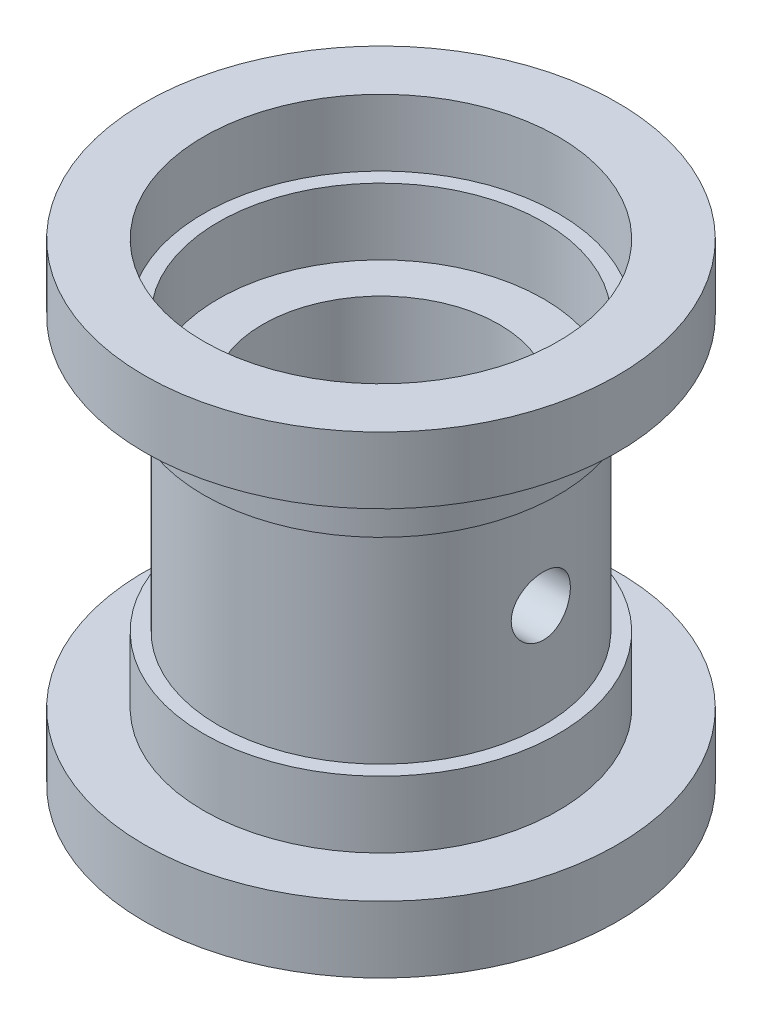
ISO-10303-21;
HEADER;
FILE_DESCRIPTION(('STEP AP214'),'2;1');
FILE_NAME('part.step','',(''),(''),'','','');
FILE_SCHEMA(('AUTOMOTIVE_DESIGN { 1 0 10303 214 1 1 1 1 }'));
ENDSEC;
DATA;
#1=APPLICATION_CONTEXT('core data for automotive mechanical design processes');
#2=APPLICATION_PROTOCOL_DEFINITION('international standard','automotive_design',2000,#1);
#3=PRODUCT_CONTEXT('',#1,'mechanical');
#4=PRODUCT('Part','Part','',(#3));
#5=PRODUCT_RELATED_PRODUCT_CATEGORY('part','',(#4));
#6=PRODUCT_DEFINITION_FORMATION('','',#4);
#7=PRODUCT_DEFINITION_CONTEXT('part definition',#1,'design');
#8=PRODUCT_DEFINITION('design','',#6,#7);
#9=PRODUCT_DEFINITION_SHAPE('','',#8);
#10=(LENGTH_UNIT() NAMED_UNIT(*) SI_UNIT(.MILLI.,.METRE.));
#11=(NAMED_UNIT(*) PLANE_ANGLE_UNIT() SI_UNIT($,.RADIAN.));
#12=(NAMED_UNIT(*) SI_UNIT($,.STERADIAN.) SOLID_ANGLE_UNIT());
#13=UNCERTAINTY_MEASURE_WITH_UNIT(LENGTH_MEASURE(1.E-05),#10,'distance_accuracy_value','');
#14=(GEOMETRIC_REPRESENTATION_CONTEXT(3) GLOBAL_UNCERTAINTY_ASSIGNED_CONTEXT((#13)) GLOBAL_UNIT_ASSIGNED_CONTEXT((#10,
#11,#12)) REPRESENTATION_CONTEXT('',''));
#15=CARTESIAN_POINT('',(0.,0.,0.));
#16=DIRECTION('',(0.,0.,1.));
#17=DIRECTION('',(1.,0.,0.));
#18=AXIS2_PLACEMENT_3D('',#15,#16,#17);
#19=CARTESIAN_POINT('',(0.,32.,0.));
#20=DIRECTION('',(0.,-1.,0.));
#21=DIRECTION('',(0.,0.,-1.));
#22=AXIS2_PLACEMENT_3D('',#19,#20,#21);
#23=CYLINDRICAL_SURFACE('',#22,32.);
#24=CARTESIAN_POINT('',(0.,-32.,0.));
#25=DIRECTION('',(0.,1.,0.));
#26=DIRECTION('',(0.,0.,1.));
#27=AXIS2_PLACEMENT_3D('',#24,#25,#26);
#28=CIRCLE('',#27,32.);
#29=CARTESIAN_POINT('',(0.,-32.,32.));
#30=VERTEX_POINT('',#29);
#31=EDGE_CURVE('E59',#30,#30,#28,.T.);
#32=ORIENTED_EDGE('',*,*,#31,.T.);
#33=EDGE_LOOP('',(#32));
#34=FACE_BOUND('',#33,.T.);
#35=CARTESIAN_POINT('',(0.,-23.,0.));
#36=DIRECTION('',(0.,1.,0.));
#37=DIRECTION('',(0.,0.,1.));
#38=AXIS2_PLACEMENT_3D('',#35,#36,#37);
#39=CIRCLE('',#38,32.);
#40=CARTESIAN_POINT('',(0.,-23.,32.));
#41=VERTEX_POINT('',#40);
#42=EDGE_CURVE('E11',#41,#41,#39,.T.);
#43=ORIENTED_EDGE('',*,*,#42,.F.);
#44=EDGE_LOOP('',(#43));
#45=FACE_BOUND('',#44,.T.);
#46=ADVANCED_FACE('F46',(#34,#45),#23,.T.);
#47=CARTESIAN_POINT('',(0.,32.,0.));
#48=DIRECTION('',(0.,-1.,0.));
#49=DIRECTION('',(0.,0.,-1.));
#50=AXIS2_PLACEMENT_3D('',#47,#48,#49);
#51=CYLINDRICAL_SURFACE('',#50,24.);
#52=CARTESIAN_POINT('',(0.,-32.,0.));
#53=DIRECTION('',(0.,1.,0.));
#54=DIRECTION('',(0.,0.,1.));
#55=AXIS2_PLACEMENT_3D('',#52,#53,#54);
#56=CIRCLE('',#55,24.);
#57=CARTESIAN_POINT('',(0.,-32.,24.));
#58=VERTEX_POINT('',#57);
#59=EDGE_CURVE('E53',#58,#58,#56,.T.);
#60=ORIENTED_EDGE('',*,*,#59,.F.);
#61=EDGE_LOOP('',(#60));
#62=FACE_BOUND('',#61,.T.);
#63=CARTESIAN_POINT('',(0.,-23.,0.));
#64=DIRECTION('',(0.,1.,0.));
#65=DIRECTION('',(0.,0.,1.));
#66=AXIS2_PLACEMENT_3D('',#63,#64,#65);
#67=CIRCLE('',#66,24.);
#68=CARTESIAN_POINT('',(0.,-23.,24.));
#69=VERTEX_POINT('',#68);
#70=EDGE_CURVE('E49',#69,#69,#67,.T.);
#71=ORIENTED_EDGE('',*,*,#70,.T.);
#72=EDGE_LOOP('',(#71));
#73=FACE_BOUND('',#72,.T.);
#74=ADVANCED_FACE('F66',(#62,#73),#51,.F.);
#75=CARTESIAN_POINT('',(0.,-32.,0.));
#76=DIRECTION('',(0.,1.,0.));
#77=DIRECTION('',(0.,0.,1.));
#78=AXIS2_PLACEMENT_3D('',#75,#76,#77);
#79=PLANE('',#78);
#80=ORIENTED_EDGE('',*,*,#59,.T.);
#81=EDGE_LOOP('',(#80));
#82=FACE_BOUND('',#81,.T.);
#83=ORIENTED_EDGE('',*,*,#31,.F.);
#84=EDGE_LOOP('',(#83));
#85=FACE_BOUND('',#84,.T.);
#86=ADVANCED_FACE('F70',(#82,#85),#79,.F.);
#87=CARTESIAN_POINT('',(0.,-23.,0.));
#88=DIRECTION('',(0.,1.,0.));
#89=DIRECTION('',(0.,0.,1.));
#90=AXIS2_PLACEMENT_3D('',#87,#88,#89);
#91=PLANE('',#90);
#92=ORIENTED_EDGE('',*,*,#70,.F.);
#93=EDGE_LOOP('',(#92));
#94=FACE_BOUND('',#93,.T.);
#95=ORIENTED_EDGE('',*,*,#42,.T.);
#96=EDGE_LOOP('',(#95));
#97=FACE_BOUND('',#96,.T.);
#98=ADVANCED_FACE('F68',(#94,#97),#91,.T.);
#99=CLOSED_SHELL('',(#46,#74,#86,#98));
#100=MANIFOLD_SOLID_BREP('B2',#99);
#101=CARTESIAN_POINT('',(0.,23.,0.));
#102=DIRECTION('',(0.,1.,0.));
#103=DIRECTION('',(0.,0.,1.));
#104=AXIS2_PLACEMENT_3D('',#101,#102,#103);
#105=PLANE('',#104);
#106=CARTESIAN_POINT('',(0.,23.,0.));
#107=DIRECTION('',(0.,1.,0.));
#108=DIRECTION('',(0.,0.,1.));
#109=AXIS2_PLACEMENT_3D('',#106,#107,#108);
#110=CIRCLE('',#109,22.);
#111=CARTESIAN_POINT('',(0.,23.,22.));
#112=VERTEX_POINT('',#111);
#113=EDGE_CURVE('E136',#112,#112,#110,.T.);
#114=ORIENTED_EDGE('',*,*,#113,.F.);
#115=EDGE_LOOP('',(#114));
#116=FACE_BOUND('',#115,.T.);
#117=CARTESIAN_POINT('',(0.,23.,0.));
#118=DIRECTION('',(0.,1.,0.));
#119=DIRECTION('',(0.,0.,1.));
#120=AXIS2_PLACEMENT_3D('',#117,#118,#119);
#121=CIRCLE('',#120,24.);
#122=CARTESIAN_POINT('',(0.,23.,24.));
#123=VERTEX_POINT('',#122);
#124=EDGE_CURVE('E128',#123,#123,#121,.T.);
#125=ORIENTED_EDGE('',*,*,#124,.T.);
#126=EDGE_LOOP('',(#125));
#127=FACE_BOUND('',#126,.T.);
#128=ADVANCED_FACE('F124',(#116,#127),#105,.T.);
#129=CARTESIAN_POINT('',(0.,-23.,0.));
#130=DIRECTION('',(0.,1.,0.));
#131=DIRECTION('',(0.,0.,1.));
#132=AXIS2_PLACEMENT_3D('',#129,#130,#131);
#133=CYLINDRICAL_SURFACE('',#132,22.);
#134=CARTESIAN_POINT('',(0.,14.,0.));
#135=DIRECTION('',(0.,1.,0.));
#136=DIRECTION('',(0.,0.,1.));
#137=AXIS2_PLACEMENT_3D('',#134,#135,#136);
#138=CIRCLE('',#137,22.);
#139=CARTESIAN_POINT('',(0.,14.,22.));
#140=VERTEX_POINT('',#139);
#141=EDGE_CURVE('E132',#140,#140,#138,.T.);
#142=ORIENTED_EDGE('',*,*,#141,.F.);
#143=EDGE_LOOP('',(#142));
#144=FACE_BOUND('',#143,.T.);
#145=ORIENTED_EDGE('',*,*,#113,.T.);
#146=EDGE_LOOP('',(#145));
#147=FACE_BOUND('',#146,.T.);
#148=ADVANCED_FACE('F151',(#144,#147),#133,.F.);
#149=CARTESIAN_POINT('',(0.,14.,0.));
#150=DIRECTION('',(0.,1.,0.));
#151=DIRECTION('',(0.,0.,1.));
#152=AXIS2_PLACEMENT_3D('',#149,#150,#151);
#153=PLANE('',#152);
#154=ORIENTED_EDGE('',*,*,#141,.T.);
#155=EDGE_LOOP('',(#154));
#156=FACE_BOUND('',#155,.T.);
#157=CARTESIAN_POINT('',(0.,14.,0.));
#158=DIRECTION('',(0.,1.,0.));
#159=DIRECTION('',(0.,0.,1.));
#160=AXIS2_PLACEMENT_3D('',#157,#158,#159);
#161=CIRCLE('',#160,24.);
#162=CARTESIAN_POINT('',(0.,14.,24.));
#163=VERTEX_POINT('',#162);
#164=EDGE_CURVE('E45',#163,#163,#161,.T.);
#165=ORIENTED_EDGE('',*,*,#164,.F.);
#166=EDGE_LOOP('',(#165));
#167=FACE_BOUND('',#166,.T.);
#168=ADVANCED_FACE('F147',(#156,#167),#153,.F.);
#169=CARTESIAN_POINT('',(0.,-23.,0.));
#170=DIRECTION('',(0.,1.,0.));
#171=DIRECTION('',(0.,0.,1.));
#172=AXIS2_PLACEMENT_3D('',#169,#170,#171);
#173=CYLINDRICAL_SURFACE('',#172,24.);
#174=ORIENTED_EDGE('',*,*,#124,.F.);
#175=EDGE_LOOP('',(#174));
#176=FACE_BOUND('',#175,.T.);
#177=ORIENTED_EDGE('',*,*,#164,.T.);
#178=EDGE_LOOP('',(#177));
#179=FACE_BOUND('',#178,.T.);
#180=ADVANCED_FACE('F126',(#176,#179),#173,.T.);
#181=CLOSED_SHELL('',(#128,#148,#168,#180));
#182=MANIFOLD_SOLID_BREP('B6',#181);
#183=CARTESIAN_POINT('',(0.,-23.,0.));
#184=DIRECTION('',(0.,1.,0.));
#185=DIRECTION('',(0.,0.,1.));
#186=AXIS2_PLACEMENT_3D('',#183,#184,#185);
#187=PLANE('',#186);
#188=CARTESIAN_POINT('',(0.,-23.,0.));
#189=DIRECTION('',(0.,1.,0.));
#190=DIRECTION('',(0.,0.,1.));
#191=AXIS2_PLACEMENT_3D('',#188,#189,#190);
#192=CIRCLE('',#191,22.);
#193=CARTESIAN_POINT('',(0.,-23.,22.));
#194=VERTEX_POINT('',#193);
#195=EDGE_CURVE('E217',#194,#194,#192,.T.);
#196=ORIENTED_EDGE('',*,*,#195,.T.);
#197=EDGE_LOOP('',(#196));
#198=FACE_BOUND('',#197,.T.);
#199=CARTESIAN_POINT('',(0.,-23.,0.));
#200=DIRECTION('',(0.,1.,0.));
#201=DIRECTION('',(0.,0.,1.));
#202=AXIS2_PLACEMENT_3D('',#199,#200,#201);
#203=CIRCLE('',#202,24.);
#204=CARTESIAN_POINT('',(0.,-23.,24.));
#205=VERTEX_POINT('',#204);
#206=EDGE_CURVE('E123',#205,#205,#203,.T.);
#207=ORIENTED_EDGE('',*,*,#206,.F.);
#208=EDGE_LOOP('',(#207));
#209=FACE_BOUND('',#208,.T.);
#210=ADVANCED_FACE('F202',(#198,#209),#187,.F.);
#211=CARTESIAN_POINT('',(0.,-23.,0.));
#212=DIRECTION('',(0.,1.,0.));
#213=DIRECTION('',(0.,0.,1.));
#214=AXIS2_PLACEMENT_3D('',#211,#212,#213);
#215=CYLINDRICAL_SURFACE('',#214,22.);
#216=ORIENTED_EDGE('',*,*,#195,.F.);
#217=EDGE_LOOP('',(#216));
#218=FACE_BOUND('',#217,.T.);
#219=CARTESIAN_POINT('',(0.,-14.,0.));
#220=DIRECTION('',(0.,1.,0.));
#221=DIRECTION('',(0.,0.,1.));
#222=AXIS2_PLACEMENT_3D('',#219,#220,#221);
#223=CIRCLE('',#222,22.);
#224=CARTESIAN_POINT('',(0.,-14.,22.));
#225=VERTEX_POINT('',#224);
#226=EDGE_CURVE('E213',#225,#225,#223,.T.);
#227=ORIENTED_EDGE('',*,*,#226,.T.);
#228=EDGE_LOOP('',(#227));
#229=FACE_BOUND('',#228,.T.);
#230=ADVANCED_FACE('F204',(#218,#229),#215,.F.);
#231=CARTESIAN_POINT('',(0.,-14.,0.));
#232=DIRECTION('',(0.,1.,0.));
#233=DIRECTION('',(0.,0.,1.));
#234=AXIS2_PLACEMENT_3D('',#231,#232,#233);
#235=PLANE('',#234);
#236=ORIENTED_EDGE('',*,*,#226,.F.);
#237=EDGE_LOOP('',(#236));
#238=FACE_BOUND('',#237,.T.);
#239=CARTESIAN_POINT('',(0.,-14.,0.));
#240=DIRECTION('',(0.,1.,0.));
#241=DIRECTION('',(0.,0.,1.));
#242=AXIS2_PLACEMENT_3D('',#239,#240,#241);
#243=CIRCLE('',#242,24.);
#244=CARTESIAN_POINT('',(0.,-14.,24.));
#245=VERTEX_POINT('',#244);
#246=EDGE_CURVE('E209',#245,#245,#243,.T.);
#247=ORIENTED_EDGE('',*,*,#246,.T.);
#248=EDGE_LOOP('',(#247));
#249=FACE_BOUND('',#248,.T.);
#250=ADVANCED_FACE('F227',(#238,#249),#235,.T.);
#251=CARTESIAN_POINT('',(0.,-23.,0.));
#252=DIRECTION('',(0.,1.,0.));
#253=DIRECTION('',(0.,0.,1.));
#254=AXIS2_PLACEMENT_3D('',#251,#252,#253);
#255=CYLINDRICAL_SURFACE('',#254,24.);
#256=ORIENTED_EDGE('',*,*,#246,.F.);
#257=EDGE_LOOP('',(#256));
#258=FACE_BOUND('',#257,.T.);
#259=ORIENTED_EDGE('',*,*,#206,.T.);
#260=EDGE_LOOP('',(#259));
#261=FACE_BOUND('',#260,.T.);
#262=ADVANCED_FACE('F231',(#258,#261),#255,.T.);
#263=CLOSED_SHELL('',(#210,#230,#250,#262));
#264=MANIFOLD_SOLID_BREP('B40',#263);
#265=CARTESIAN_POINT('',(0.,32.,0.));
#266=DIRECTION('',(0.,-1.,0.));
#267=DIRECTION('',(0.,0.,-1.));
#268=AXIS2_PLACEMENT_3D('',#265,#266,#267);
#269=CYLINDRICAL_SURFACE('',#268,24.);
#270=CARTESIAN_POINT('',(0.,23.,0.));
#271=DIRECTION('',(0.,1.,0.));
#272=DIRECTION('',(0.,0.,1.));
#273=AXIS2_PLACEMENT_3D('',#270,#271,#272);
#274=CIRCLE('',#273,24.);
#275=CARTESIAN_POINT('',(0.,23.,24.));
#276=VERTEX_POINT('',#275);
#277=EDGE_CURVE('E294',#276,#276,#274,.T.);
#278=ORIENTED_EDGE('',*,*,#277,.F.);
#279=EDGE_LOOP('',(#278));
#280=FACE_BOUND('',#279,.T.);
#281=CARTESIAN_POINT('',(0.,32.,0.));
#282=DIRECTION('',(0.,1.,0.));
#283=DIRECTION('',(0.,0.,1.));
#284=AXIS2_PLACEMENT_3D('',#281,#282,#283);
#285=CIRCLE('',#284,24.);
#286=CARTESIAN_POINT('',(0.,32.,24.));
#287=VERTEX_POINT('',#286);
#288=EDGE_CURVE('E283',#287,#287,#285,.T.);
#289=ORIENTED_EDGE('',*,*,#288,.T.);
#290=EDGE_LOOP('',(#289));
#291=FACE_BOUND('',#290,.T.);
#292=ADVANCED_FACE('F279',(#280,#291),#269,.F.);
#293=CARTESIAN_POINT('',(0.,32.,0.));
#294=DIRECTION('',(0.,1.,0.));
#295=DIRECTION('',(0.,0.,1.));
#296=AXIS2_PLACEMENT_3D('',#293,#294,#295);
#297=PLANE('',#296);
#298=ORIENTED_EDGE('',*,*,#288,.F.);
#299=EDGE_LOOP('',(#298));
#300=FACE_BOUND('',#299,.T.);
#301=CARTESIAN_POINT('',(0.,32.,0.));
#302=DIRECTION('',(0.,1.,0.));
#303=DIRECTION('',(0.,0.,1.));
#304=AXIS2_PLACEMENT_3D('',#301,#302,#303);
#305=CIRCLE('',#304,32.);
#306=CARTESIAN_POINT('',(0.,32.,32.));
#307=VERTEX_POINT('',#306);
#308=EDGE_CURVE('E201',#307,#307,#305,.T.);
#309=ORIENTED_EDGE('',*,*,#308,.T.);
#310=EDGE_LOOP('',(#309));
#311=FACE_BOUND('',#310,.T.);
#312=ADVANCED_FACE('F281',(#300,#311),#297,.T.);
#313=CARTESIAN_POINT('',(0.,32.,0.));
#314=DIRECTION('',(0.,-1.,0.));
#315=DIRECTION('',(0.,0.,-1.));
#316=AXIS2_PLACEMENT_3D('',#313,#314,#315);
#317=CYLINDRICAL_SURFACE('',#316,32.);
#318=CARTESIAN_POINT('',(0.,23.,0.));
#319=DIRECTION('',(0.,1.,0.));
#320=DIRECTION('',(0.,0.,1.));
#321=AXIS2_PLACEMENT_3D('',#318,#319,#320);
#322=CIRCLE('',#321,32.);
#323=CARTESIAN_POINT('',(0.,23.,32.));
#324=VERTEX_POINT('',#323);
#325=EDGE_CURVE('E290',#324,#324,#322,.T.);
#326=ORIENTED_EDGE('',*,*,#325,.T.);
#327=EDGE_LOOP('',(#326));
#328=FACE_BOUND('',#327,.T.);
#329=ORIENTED_EDGE('',*,*,#308,.F.);
#330=EDGE_LOOP('',(#329));
#331=FACE_BOUND('',#330,.T.);
#332=ADVANCED_FACE('F307',(#328,#331),#317,.T.);
#333=CARTESIAN_POINT('',(0.,23.,0.));
#334=DIRECTION('',(0.,1.,0.));
#335=DIRECTION('',(0.,0.,1.));
#336=AXIS2_PLACEMENT_3D('',#333,#334,#335);
#337=PLANE('',#336);
#338=ORIENTED_EDGE('',*,*,#277,.T.);
#339=EDGE_LOOP('',(#338));
#340=FACE_BOUND('',#339,.T.);
#341=ORIENTED_EDGE('',*,*,#325,.F.);
#342=EDGE_LOOP('',(#341));
#343=FACE_BOUND('',#342,.T.);
#344=ADVANCED_FACE('F298',(#340,#343),#337,.F.);
#345=CLOSED_SHELL('',(#292,#312,#332,#344));
#346=MANIFOLD_SOLID_BREP('B118',#345);
#347=CARTESIAN_POINT('',(0.,-14.,0.));
#348=DIRECTION('',(0.,1.,0.));
#349=DIRECTION('',(0.,0.,1.));
#350=AXIS2_PLACEMENT_3D('',#347,#348,#349);
#351=PLANE('',#350);
#352=CARTESIAN_POINT('',(0.,-14.,0.));
#353=DIRECTION('',(0.,1.,0.));
#354=DIRECTION('',(0.,0.,1.));
#355=AXIS2_PLACEMENT_3D('',#352,#353,#354);
#356=CIRCLE('',#355,16.);
#357=CARTESIAN_POINT('',(0.,-14.,16.));
#358=VERTEX_POINT('',#357);
#359=EDGE_CURVE('E368',#358,#358,#356,.T.);
#360=ORIENTED_EDGE('',*,*,#359,.T.);
#361=EDGE_LOOP('',(#360));
#362=FACE_BOUND('',#361,.T.);
#363=CARTESIAN_POINT('',(0.,-14.,0.));
#364=DIRECTION('',(0.,1.,0.));
#365=DIRECTION('',(0.,0.,1.));
#366=AXIS2_PLACEMENT_3D('',#363,#364,#365);
#367=CIRCLE('',#366,22.);
#368=CARTESIAN_POINT('',(0.,-14.,22.));
#369=VERTEX_POINT('',#368);
#370=EDGE_CURVE('E278',#369,#369,#367,.T.);
#371=ORIENTED_EDGE('',*,*,#370,.F.);
#372=EDGE_LOOP('',(#371));
#373=FACE_BOUND('',#372,.T.);
#374=ADVANCED_FACE('F349',(#362,#373),#351,.F.);
#375=CARTESIAN_POINT('',(0.,14.,0.));
#376=DIRECTION('',(0.,-1.,0.));
#377=DIRECTION('',(0.,0.,-1.));
#378=AXIS2_PLACEMENT_3D('',#375,#376,#377);
#379=CYLINDRICAL_SURFACE('',#378,16.);
#380=CARTESIAN_POINT('',(-15.4919333848297,0.,-4.));
#381=CARTESIAN_POINT('',(-15.4919376014058,0.220881201482523,-3.99999372574892));
#382=CARTESIAN_POINT('',(-15.4967088962336,0.441831837885635,-3.98164199279624));
#383=CARTESIAN_POINT('',(-15.515229791881,0.877388125077615,-3.90883700074207));
#384=CARTESIAN_POINT('',(-15.5289846179461,1.0919900071491,-3.85436273078737));
#385=CARTESIAN_POINT('',(-15.5638195935384,1.50848566109949,-3.71118591941126));
#386=CARTESIAN_POINT('',(-15.5848902830473,1.71039544861713,-3.62252756456719));
#387=CARTESIAN_POINT('',(-15.6319710724601,2.09649736406381,-3.41363382601822));
#388=CARTESIAN_POINT('',(-15.6579813820558,2.28068873932835,-3.2933971016971));
#389=CARTESIAN_POINT('',(-15.71265146169,2.63017863241954,-3.02193348369901));
#390=CARTESIAN_POINT('',(-15.7413535619685,2.79502976056007,-2.87013902032648));
#391=CARTESIAN_POINT('',(-15.7978060082447,3.09721823097654,-2.54109130256106));
#392=CARTESIAN_POINT('',(-15.8255562650622,3.23455300099479,-2.36383567068849));
#393=CARTESIAN_POINT('',(-15.8774466483293,3.47964074821004,-1.98583232172633));
#394=CARTESIAN_POINT('',(-15.9015309984095,3.58695422105834,-1.78479132191219));
#395=CARTESIAN_POINT('',(-15.9428929908157,3.76609543064493,-1.36682109486842));
#396=CARTESIAN_POINT('',(-15.9601716373495,3.83792840306482,-1.1498942172671));
#397=CARTESIAN_POINT('',(-15.9856761415709,3.94263653532574,-0.710974014006659));
#398=CARTESIAN_POINT('',(-15.994078301509,3.97627143092253,-0.489172351278363));
#399=CARTESIAN_POINT('',(-16.0014975057168,4.00601340684088,-0.0429261108204307));
#400=CARTESIAN_POINT('',(-16.0005159375474,4.00212603553535,0.181518071260913));
#401=CARTESIAN_POINT('',(-15.9894095192564,3.95748023959978,0.621408988689544));
#402=CARTESIAN_POINT('',(-15.9794880374535,3.91754187991386,0.836944862404251));
#403=CARTESIAN_POINT('',(-15.9518533843981,3.80324596792237,1.25815298965476));
#404=CARTESIAN_POINT('',(-15.9341397983768,3.72888658339603,1.46382471748181));
#405=CARTESIAN_POINT('',(-15.8926001552126,3.54719588690082,1.86162681400717));
#406=CARTESIAN_POINT('',(-15.8687203151142,3.43957272854166,2.0536180390658));
#407=CARTESIAN_POINT('',(-15.817438460961,3.19463091341354,2.41710248936217));
#408=CARTESIAN_POINT('',(-15.7900358344647,3.05730709030132,2.58859214034283));
#409=CARTESIAN_POINT('',(-15.7338194202868,2.75246601282993,2.91109614033899));
#410=CARTESIAN_POINT('',(-15.7049875123183,2.5842321722501,3.06143071629766));
#411=CARTESIAN_POINT('',(-15.6498406963637,2.22464004232906,3.33190550385521));
#412=CARTESIAN_POINT('',(-15.6235259060557,2.03328067278997,3.45204430419577));
#413=CARTESIAN_POINT('',(-15.5763279489438,1.63153594538063,3.6591525160815));
#414=CARTESIAN_POINT('',(-15.5554717382566,1.42106283157905,3.74595826784276));
#415=CARTESIAN_POINT('',(-15.5218982411655,0.987863251159866,3.88274248250566));
#416=CARTESIAN_POINT('',(-15.5091792131627,0.765139417649982,3.93272882620157));
#417=CARTESIAN_POINT('',(-15.4936856964321,0.320064797534446,3.99332742187493));
#418=CARTESIAN_POINT('',(-15.4906574237147,0.097859530649626,4.00494475827312));
#419=CARTESIAN_POINT('',(-15.4941974937513,-0.345315098531671,3.99122718482172));
#420=CARTESIAN_POINT('',(-15.5007649531025,-0.566284572717847,3.96589567655901));
#421=CARTESIAN_POINT('',(-15.5225133117816,-0.996982823918955,3.87988074230187));
#422=CARTESIAN_POINT('',(-15.5375515238864,-1.20683636251105,3.81978250925122));
#423=CARTESIAN_POINT('',(-15.574411492199,-1.61349033256499,3.66658893067256));
#424=CARTESIAN_POINT('',(-15.5962340519409,-1.81028921448916,3.57348967633996));
#425=CARTESIAN_POINT('',(-15.6447381935298,-2.18950604458712,3.35483306869861));
#426=CARTESIAN_POINT('',(-15.6715066977164,-2.37156614406879,3.22867480613704));
#427=CARTESIAN_POINT('',(-15.7266733291374,-2.71230138048234,2.94824117173779));
#428=CARTESIAN_POINT('',(-15.7550717236528,-2.87097266664016,2.79396117922175));
#429=CARTESIAN_POINT('',(-15.8111584485085,-3.16449766811348,2.45705088393891));
#430=CARTESIAN_POINT('',(-15.8388112329901,-3.29865610007809,2.27380781012638));
#431=CARTESIAN_POINT('',(-15.889555465819,-3.534297387122,1.8868107307787));
#432=CARTESIAN_POINT('',(-15.9126471520632,-3.63578194657313,1.68305779583036));
#433=CARTESIAN_POINT('',(-15.9515218518132,-3.80231365524469,1.26223280692436));
#434=CARTESIAN_POINT('',(-15.9673572803586,-3.8676228550065,1.04526952411153));
#435=CARTESIAN_POINT('',(-15.9901646943326,-3.96073653537346,0.602999041275228));
#436=CARTESIAN_POINT('',(-15.9971383902947,-3.98854825398246,0.377693460164962));
#437=CARTESIAN_POINT('',(-16.0013667763522,-4.00547035830216,-0.0683341057732934));
#438=CARTESIAN_POINT('',(-15.9988791551995,-3.99560683638163,-0.289015307864088));
#439=CARTESIAN_POINT('',(-15.9850358582977,-3.9398086908226,-0.725469985659004));
#440=CARTESIAN_POINT('',(-15.9736804462868,-3.89387513994732,-0.941243607123715));
#441=CARTESIAN_POINT('',(-15.9434173141556,-3.76779112091655,-1.3606841425791));
#442=CARTESIAN_POINT('',(-15.9245505800957,-3.68782618674249,-1.56440997832345));
#443=CARTESIAN_POINT('',(-15.8812515565463,-3.49611768392171,-1.9556682121665));
#444=CARTESIAN_POINT('',(-15.8568185655503,-3.38437010931806,-2.14319856506253));
#445=CARTESIAN_POINT('',(-15.8042899872115,-3.12913906401547,-2.50160771369321));
#446=CARTESIAN_POINT('',(-15.7761206776666,-2.98495942838468,-2.67197995319334));
#447=CARTESIAN_POINT('',(-15.7196259622876,-2.67030859209061,-2.98646008109402));
#448=CARTESIAN_POINT('',(-15.6913005186921,-2.49983073555535,-3.13056130030636));
#449=CARTESIAN_POINT('',(-15.6370990338201,-2.13359434324216,-3.39104810588733));
#450=CARTESIAN_POINT('',(-15.6112785469316,-1.93742350653899,-3.50686647766551));
#451=CARTESIAN_POINT('',(-15.5657582197931,-1.52777804050072,-3.70370758634188));
#452=CARTESIAN_POINT('',(-15.5460539293285,-1.31431613562461,-3.78475563900861));
#453=CARTESIAN_POINT('',(-15.5180763500295,-0.917691952659358,-3.89769011428401));
#454=CARTESIAN_POINT('',(-15.50834652014,-0.736427342455453,-3.93597268238751));
#455=CARTESIAN_POINT('',(-15.4952735433048,-0.370124524009249,-3.98712917028708));
#456=CARTESIAN_POINT('',(-15.4919298515643,-0.185086639022391,-4.000005257487));
#457=CARTESIAN_POINT('',(-15.4919333848297,0.,-4.));
#458=B_SPLINE_CURVE_WITH_KNOTS('',3,(#380,#381,#382,#383,#384,#385,#386,#387,#388,#389,#390,
#391,#392,#393,#394,#395,#396,#397,#398,#399,#400,#401,#402,#403,#404,#405,#406,#407,#408,#409,
#410,#411,#412,#413,#414,#415,#416,#417,#418,#419,#420,#421,#422,#423,#424,#425,#426,#427,#428,
#429,#430,#431,#432,#433,#434,#435,#436,#437,#438,#439,#440,#441,#442,#443,#444,#445,#446,#447,
#448,#449,#450,#451,#452,#453,#454,#455,#456,#457),.UNSPECIFIED.,.T.,.F.,(4,2,2,2,2,2,2,2,2,2,2,
2,2,2,2,2,2,2,2,2,2,2,2,2,2,2,2,2,2,2,2,2,2,2,2,2,2,2,4),(0.,0.661963906777818,1.32431318628587,
1.98580916346563,2.64733322808766,3.32198326708762,3.99669634367786,4.68082394236672,
5.36485055755348,6.03502001592554,6.70509037865633,7.36029220302315,8.01552890759658,
8.67668598807111,9.33795816750261,10.0171274651506,10.6963284991968,11.3788229121533,
12.0611712021133,12.7254971962678,13.3897620350605,14.043158480267,14.6966323428624,
15.3629255338662,16.0293283022804,16.7124052955648,17.3954466516326,18.0734731650306,
18.7513687826643,19.410935138159,20.0704818781514,20.7264780250751,21.3825568919289,
22.0543535454328,22.7263205051678,23.4108236366987,24.0948275420408,24.6495652350122,
25.2042556017672),.UNSPECIFIED.);
#459=CARTESIAN_POINT('',(-15.4919333848297,0.,-4.));
#460=VERTEX_POINT('',#459);
#461=EDGE_CURVE('E372',#460,#460,#458,.T.);
#462=ORIENTED_EDGE('',*,*,#461,.F.);
#463=EDGE_LOOP('',(#462));
#464=FACE_BOUND('',#463,.T.);
#465=CARTESIAN_POINT('',(15.4919333848297,0.,-4.));
#466=CARTESIAN_POINT('',(15.4919376014058,-0.220881201482523,-3.99999372574892));
#467=CARTESIAN_POINT('',(15.4967088962336,-0.441831837885635,-3.98164199279624));
#468=CARTESIAN_POINT('',(15.515229791881,-0.877388125077615,-3.90883700074207));
#469=CARTESIAN_POINT('',(15.5289846179461,-1.0919900071491,-3.85436273078737));
#470=CARTESIAN_POINT('',(15.5638195935384,-1.50848566109949,-3.71118591941126));
#471=CARTESIAN_POINT('',(15.5848902830473,-1.71039544861713,-3.62252756456719));
#472=CARTESIAN_POINT('',(15.6319710724601,-2.09649736406381,-3.41363382601822));
#473=CARTESIAN_POINT('',(15.6579813820558,-2.28068873932835,-3.2933971016971));
#474=CARTESIAN_POINT('',(15.71265146169,-2.63017863241954,-3.02193348369901));
#475=CARTESIAN_POINT('',(15.7413535619685,-2.79502976056007,-2.87013902032648));
#476=CARTESIAN_POINT('',(15.7978060082447,-3.09721823097654,-2.54109130256106));
#477=CARTESIAN_POINT('',(15.8255562650622,-3.23455300099479,-2.36383567068849));
#478=CARTESIAN_POINT('',(15.8774466483293,-3.47964074821004,-1.98583232172633));
#479=CARTESIAN_POINT('',(15.9015309984095,-3.58695422105834,-1.78479132191219));
#480=CARTESIAN_POINT('',(15.9428929908157,-3.76609543064493,-1.36682109486842));
#481=CARTESIAN_POINT('',(15.9601716373495,-3.83792840306482,-1.1498942172671));
#482=CARTESIAN_POINT('',(15.9856761415709,-3.94263653532574,-0.710974014006659));
#483=CARTESIAN_POINT('',(15.994078301509,-3.97627143092253,-0.489172351278363));
#484=CARTESIAN_POINT('',(16.0014975057168,-4.00601340684088,-0.0429261108204307));
#485=CARTESIAN_POINT('',(16.0005159375474,-4.00212603553535,0.181518071260913));
#486=CARTESIAN_POINT('',(15.9894095192564,-3.95748023959978,0.621408988689544));
#487=CARTESIAN_POINT('',(15.9794880374535,-3.91754187991386,0.836944862404251));
#488=CARTESIAN_POINT('',(15.9518533843981,-3.80324596792237,1.25815298965476));
#489=CARTESIAN_POINT('',(15.9341397983768,-3.72888658339603,1.46382471748181));
#490=CARTESIAN_POINT('',(15.8926001552126,-3.54719588690082,1.86162681400717));
#491=CARTESIAN_POINT('',(15.8687203151142,-3.43957272854166,2.0536180390658));
#492=CARTESIAN_POINT('',(15.817438460961,-3.19463091341354,2.41710248936217));
#493=CARTESIAN_POINT('',(15.7900358344647,-3.05730709030132,2.58859214034283));
#494=CARTESIAN_POINT('',(15.7338194202868,-2.75246601282993,2.91109614033899));
#495=CARTESIAN_POINT('',(15.7049875123183,-2.5842321722501,3.06143071629766));
#496=CARTESIAN_POINT('',(15.6498406963637,-2.22464004232906,3.33190550385521));
#497=CARTESIAN_POINT('',(15.6235259060557,-2.03328067278997,3.45204430419577));
#498=CARTESIAN_POINT('',(15.5763279489438,-1.63153594538063,3.6591525160815));
#499=CARTESIAN_POINT('',(15.5554717382566,-1.42106283157905,3.74595826784276));
#500=CARTESIAN_POINT('',(15.5218982411655,-0.987863251159866,3.88274248250566));
#501=CARTESIAN_POINT('',(15.5091792131627,-0.765139417649982,3.93272882620157));
#502=CARTESIAN_POINT('',(15.4936856964321,-0.320064797534446,3.99332742187493));
#503=CARTESIAN_POINT('',(15.4906574237147,-0.097859530649626,4.00494475827312));
#504=CARTESIAN_POINT('',(15.4941974937513,0.345315098531671,3.99122718482172));
#505=CARTESIAN_POINT('',(15.5007649531025,0.566284572717847,3.96589567655901));
#506=CARTESIAN_POINT('',(15.5225133117816,0.996982823918955,3.87988074230187));
#507=CARTESIAN_POINT('',(15.5375515238864,1.20683636251105,3.81978250925122));
#508=CARTESIAN_POINT('',(15.574411492199,1.61349033256499,3.66658893067256));
#509=CARTESIAN_POINT('',(15.5962340519409,1.81028921448916,3.57348967633996));
#510=CARTESIAN_POINT('',(15.6447381935298,2.18950604458712,3.35483306869861));
#511=CARTESIAN_POINT('',(15.6715066977164,2.37156614406879,3.22867480613704));
#512=CARTESIAN_POINT('',(15.7266733291374,2.71230138048234,2.94824117173779));
#513=CARTESIAN_POINT('',(15.7550717236528,2.87097266664016,2.79396117922175));
#514=CARTESIAN_POINT('',(15.8111584485085,3.16449766811348,2.45705088393891));
#515=CARTESIAN_POINT('',(15.8388112329901,3.29865610007809,2.27380781012638));
#516=CARTESIAN_POINT('',(15.889555465819,3.534297387122,1.8868107307787));
#517=CARTESIAN_POINT('',(15.9126471520632,3.63578194657313,1.68305779583036));
#518=CARTESIAN_POINT('',(15.9515218518132,3.80231365524469,1.26223280692436));
#519=CARTESIAN_POINT('',(15.9673572803586,3.8676228550065,1.04526952411153));
#520=CARTESIAN_POINT('',(15.9901646943326,3.96073653537346,0.602999041275228));
#521=CARTESIAN_POINT('',(15.9971383902947,3.98854825398246,0.377693460164962));
#522=CARTESIAN_POINT('',(16.0013667763522,4.00547035830216,-0.0683341057732934));
#523=CARTESIAN_POINT('',(15.9988791551995,3.99560683638163,-0.289015307864088));
#524=CARTESIAN_POINT('',(15.9850358582977,3.9398086908226,-0.725469985659004));
#525=CARTESIAN_POINT('',(15.9736804462868,3.89387513994732,-0.941243607123715));
#526=CARTESIAN_POINT('',(15.9434173141556,3.76779112091655,-1.3606841425791));
#527=CARTESIAN_POINT('',(15.9245505800957,3.68782618674249,-1.56440997832345));
#528=CARTESIAN_POINT('',(15.8812515565463,3.49611768392171,-1.9556682121665));
#529=CARTESIAN_POINT('',(15.8568185655503,3.38437010931806,-2.14319856506253));
#530=CARTESIAN_POINT('',(15.8042899872115,3.12913906401547,-2.50160771369321));
#531=CARTESIAN_POINT('',(15.7761206776666,2.98495942838468,-2.67197995319334));
#532=CARTESIAN_POINT('',(15.7196259622876,2.67030859209061,-2.98646008109402));
#533=CARTESIAN_POINT('',(15.6913005186921,2.49983073555535,-3.13056130030636));
#534=CARTESIAN_POINT('',(15.6370990338201,2.13359434324216,-3.39104810588733));
#535=CARTESIAN_POINT('',(15.6112785469316,1.93742350653899,-3.50686647766551));
#536=CARTESIAN_POINT('',(15.5657582197931,1.52777804050072,-3.70370758634188));
#537=CARTESIAN_POINT('',(15.5460539293285,1.31431613562461,-3.78475563900861));
#538=CARTESIAN_POINT('',(15.5180763500295,0.917691952659358,-3.89769011428401));
#539=CARTESIAN_POINT('',(15.50834652014,0.736427342455453,-3.93597268238751));
#540=CARTESIAN_POINT('',(15.4952735433048,0.370124524009249,-3.98712917028708));
#541=CARTESIAN_POINT('',(15.4919298515643,0.185086639022391,-4.000005257487));
#542=CARTESIAN_POINT('',(15.4919333848297,0.,-4.));
#543=B_SPLINE_CURVE_WITH_KNOTS('',3,(#465,#466,#467,#468,#469,#470,#471,#472,#473,#474,#475,
#476,#477,#478,#479,#480,#481,#482,#483,#484,#485,#486,#487,#488,#489,#490,#491,#492,#493,#494,
#495,#496,#497,#498,#499,#500,#501,#502,#503,#504,#505,#506,#507,#508,#509,#510,#511,#512,#513,
#514,#515,#516,#517,#518,#519,#520,#521,#522,#523,#524,#525,#526,#527,#528,#529,#530,#531,#532,
#533,#534,#535,#536,#537,#538,#539,#540,#541,#542),.UNSPECIFIED.,.T.,.F.,(4,2,2,2,2,2,2,2,2,2,2,
2,2,2,2,2,2,2,2,2,2,2,2,2,2,2,2,2,2,2,2,2,2,2,2,2,2,2,4),(0.,0.661963906777818,1.32431318628587,
1.98580916346563,2.64733322808766,3.32198326708762,3.99669634367786,4.68082394236672,
5.36485055755348,6.03502001592554,6.70509037865633,7.36029220302315,8.01552890759658,
8.67668598807111,9.33795816750261,10.0171274651506,10.6963284991968,11.3788229121533,
12.0611712021133,12.7254971962678,13.3897620350605,14.043158480267,14.6966323428624,
15.3629255338662,16.0293283022804,16.7124052955648,17.3954466516326,18.0734731650306,
18.7513687826643,19.410935138159,20.0704818781514,20.7264780250751,21.3825568919289,
22.0543535454328,22.7263205051678,23.4108236366987,24.0948275420408,24.6495652350122,
25.2042556017672),.UNSPECIFIED.);
#544=CARTESIAN_POINT('',(15.4919333848297,0.,-4.));
#545=VERTEX_POINT('',#544);
#546=EDGE_CURVE('E397',#545,#545,#543,.T.);
#547=ORIENTED_EDGE('',*,*,#546,.F.);
#548=EDGE_LOOP('',(#547));
#549=FACE_BOUND('',#548,.T.);
#550=CARTESIAN_POINT('',(0.,14.,0.));
#551=DIRECTION('',(0.,1.,0.));
#552=DIRECTION('',(0.,0.,1.));
#553=AXIS2_PLACEMENT_3D('',#550,#551,#552);
#554=CIRCLE('',#553,16.);
#555=CARTESIAN_POINT('',(0.,14.,16.));
#556=VERTEX_POINT('',#555);
#557=EDGE_CURVE('E363',#556,#556,#554,.T.);
#558=ORIENTED_EDGE('',*,*,#557,.T.);
#559=EDGE_LOOP('',(#558));
#560=FACE_BOUND('',#559,.T.);
#561=ORIENTED_EDGE('',*,*,#359,.F.);
#562=EDGE_LOOP('',(#561));
#563=FACE_BOUND('',#562,.T.);
#564=ADVANCED_FACE('F351',(#464,#549,#560,#563),#379,.F.);
#565=CARTESIAN_POINT('',(0.,14.,0.));
#566=DIRECTION('',(0.,1.,0.));
#567=DIRECTION('',(0.,0.,1.));
#568=AXIS2_PLACEMENT_3D('',#565,#566,#567);
#569=PLANE('',#568);
#570=ORIENTED_EDGE('',*,*,#557,.F.);
#571=EDGE_LOOP('',(#570));
#572=FACE_BOUND('',#571,.T.);
#573=CARTESIAN_POINT('',(0.,14.,0.));
#574=DIRECTION('',(0.,1.,0.));
#575=DIRECTION('',(0.,0.,1.));
#576=AXIS2_PLACEMENT_3D('',#573,#574,#575);
#577=CIRCLE('',#576,22.);
#578=CARTESIAN_POINT('',(0.,14.,22.));
#579=VERTEX_POINT('',#578);
#580=EDGE_CURVE('E377',#579,#579,#577,.T.);
#581=ORIENTED_EDGE('',*,*,#580,.T.);
#582=EDGE_LOOP('',(#581));
#583=FACE_BOUND('',#582,.T.);
#584=ADVANCED_FACE('F410',(#572,#583),#569,.T.);
#585=CARTESIAN_POINT('',(0.,-14.,0.));
#586=DIRECTION('',(0.,1.,0.));
#587=DIRECTION('',(0.,0.,1.));
#588=AXIS2_PLACEMENT_3D('',#585,#586,#587);
#589=CYLINDRICAL_SURFACE('',#588,22.);
#590=CARTESIAN_POINT('',(-21.6333076527839,0.,-4.));
#591=CARTESIAN_POINT('',(-21.6333118939645,-0.22268024514592,-3.99999133497668));
#592=CARTESIAN_POINT('',(-21.636783172832,-0.445474382576009,-3.98134200846101));
#593=CARTESIAN_POINT('',(-21.650277261808,-0.884789231745938,-3.907282639324));
#594=CARTESIAN_POINT('',(-21.6603057667963,-1.10130431933857,-3.85184064204138));
#595=CARTESIAN_POINT('',(-21.6857418061113,-1.52164062603702,-3.70594738579437));
#596=CARTESIAN_POINT('',(-21.7011444752348,-1.7254731306161,-3.61552778385548));
#597=CARTESIAN_POINT('',(-21.7355875966023,-2.11505978325792,-3.40232850816631));
#598=CARTESIAN_POINT('',(-21.7546277295314,-2.30081551603275,-3.27955167453961));
#599=CARTESIAN_POINT('',(-21.7944494758657,-2.65116689488351,-3.00359049647932));
#600=CARTESIAN_POINT('',(-21.8152472612912,-2.81552014846791,-2.85010070695621));
#601=CARTESIAN_POINT('',(-21.8560978635286,-3.11629112566885,-2.51773079268323));
#602=CARTESIAN_POINT('',(-21.8761506327525,-3.25270706729076,-2.338849049527));
#603=CARTESIAN_POINT('',(-21.9134244798488,-3.49465463690047,-1.95918683799973));
#604=CARTESIAN_POINT('',(-21.930624292806,-3.59995853999161,-1.75825898095977));
#605=CARTESIAN_POINT('',(-21.9600735467303,-3.77522666605229,-1.34119954887522));
#606=CARTESIAN_POINT('',(-21.9723233703801,-3.84519362101874,-1.12506915065336));
#607=CARTESIAN_POINT('',(-21.9903782117666,-3.94705446651091,-0.686249675641717));
#608=CARTESIAN_POINT('',(-21.9962522909049,-3.97935662864144,-0.463658257037537));
#609=CARTESIAN_POINT('',(-22.0011316177893,-4.0062423349248,-0.0161429459318502));
#610=CARTESIAN_POINT('',(-22.0001374169679,-4.00082890714308,0.208780757870076));
#611=CARTESIAN_POINT('',(-21.9914463710423,-3.95275171584416,0.65177839228148));
#612=CARTESIAN_POINT('',(-21.9838286175382,-3.91052749297112,0.869901800106699));
#613=CARTESIAN_POINT('',(-21.9628349381595,-3.79072160507699,1.29591498120673));
#614=CARTESIAN_POINT('',(-21.949458811838,-3.71313870922753,1.50380439795921));
#615=CARTESIAN_POINT('',(-21.9183184074471,-3.52439388044169,1.90473245090769));
#616=CARTESIAN_POINT('',(-21.9005310604676,-3.41305471193233,2.09768578503493));
#617=CARTESIAN_POINT('',(-21.8625379364345,-3.16008822015063,2.46233526714585));
#618=CARTESIAN_POINT('',(-21.8423319276856,-3.01845799412901,2.63402937539644));
#619=CARTESIAN_POINT('',(-21.8013981618568,-2.70650309084144,2.95388890108789));
#620=CARTESIAN_POINT('',(-21.7806670830423,-2.53579396416202,3.10167918809898));
#621=CARTESIAN_POINT('',(-21.7412992413716,-2.17181187215816,3.36658543928332));
#622=CARTESIAN_POINT('',(-21.7226625056581,-1.97853861446948,3.48370100593934));
#623=CARTESIAN_POINT('',(-21.6895894681967,-1.57443497902635,3.68403076498185));
#624=CARTESIAN_POINT('',(-21.6751596002547,-1.36357833672042,3.76719310770445));
#625=CARTESIAN_POINT('',(-21.6522346695387,-0.930565100223262,3.89680753773996));
#626=CARTESIAN_POINT('',(-21.6437389774287,-0.708409706977712,3.94326351793351));
#627=CARTESIAN_POINT('',(-21.6337680818549,-0.262480397589181,3.99760435703092));
#628=CARTESIAN_POINT('',(-21.6321950076555,-0.0387741346607272,4.00602696978329));
#629=CARTESIAN_POINT('',(-21.6359859030778,0.406849101122151,3.98550109557699));
#630=CARTESIAN_POINT('',(-21.6413495511773,0.628766156427925,3.95655434071577));
#631=CARTESIAN_POINT('',(-21.6583185875735,1.06276068810456,3.86257219277794));
#632=CARTESIAN_POINT('',(-21.6698756001577,1.27490076801606,3.79781637710752));
#633=CARTESIAN_POINT('',(-21.6978878160151,1.68531943765688,3.63434995143755));
#634=CARTESIAN_POINT('',(-21.7143433613546,1.88359705817135,3.53563697012216));
#635=CARTESIAN_POINT('',(-21.7505226830533,2.26303839203049,3.30581172375987));
#636=CARTESIAN_POINT('',(-21.7702800968595,2.44399223616877,3.17435835883133));
#637=CARTESIAN_POINT('',(-21.8107413258404,2.78146738319551,2.88324609901472));
#638=CARTESIAN_POINT('',(-21.8314452207,2.93798662399931,2.72358482602649));
#639=CARTESIAN_POINT('',(-21.8717797209063,3.22414569229957,2.37819260014522));
#640=CARTESIAN_POINT('',(-21.8913936565351,3.35342471072361,2.19216046504753));
#641=CARTESIAN_POINT('',(-21.9270616275553,3.57889261216599,1.80070523958705));
#642=CARTESIAN_POINT('',(-21.9431157941211,3.67508271455434,1.59528286413569));
#643=CARTESIAN_POINT('',(-21.9697834526315,3.83109607727288,1.17189643669068));
#644=CARTESIAN_POINT('',(-21.9804239020959,3.89109980975306,0.954000658707901));
#645=CARTESIAN_POINT('',(-21.9951799495618,3.97361468659431,0.511013297926958));
#646=CARTESIAN_POINT('',(-21.9992961913554,3.99612953027341,0.28592242735846));
#647=CARTESIAN_POINT('',(-22.0005282842776,4.00290504221103,-0.161599238057635));
#648=CARTESIAN_POINT('',(-21.9977440646224,3.98771177696937,-0.384021675850897));
#649=CARTESIAN_POINT('',(-21.9856946780428,3.92069410715213,-0.823089077981735));
#650=CARTESIAN_POINT('',(-21.9764295654387,3.86887000960198,-1.03973409072766));
#651=CARTESIAN_POINT('',(-21.9524581381546,3.73028619302147,-1.46083086688086));
#652=CARTESIAN_POINT('',(-21.9377603669599,3.64358130924888,-1.6653011932924));
#653=CARTESIAN_POINT('',(-21.9045184478405,3.43776119438248,-2.05687402388434));
#654=CARTESIAN_POINT('',(-21.8859740630709,3.31864396744516,-2.24397545759469));
#655=CARTESIAN_POINT('',(-21.8467718041457,3.04948472287622,-2.59822919507098));
#656=CARTESIAN_POINT('',(-21.826088758947,2.89904660923133,-2.76507779716898));
#657=CARTESIAN_POINT('',(-21.7851034058444,2.57234096661293,-3.07135244710173));
#658=CARTESIAN_POINT('',(-21.7648011884524,2.39606738287678,-3.21077204872679));
#659=CARTESIAN_POINT('',(-21.7266856567864,2.02088064879777,-3.45935343607217));
#660=CARTESIAN_POINT('',(-21.7088952940926,1.8217855213773,-3.56824417003713));
#661=CARTESIAN_POINT('',(-21.6780923491353,1.40787344654803,-3.75086117813966));
#662=CARTESIAN_POINT('',(-21.6650751844592,1.19307181678437,-3.82462119925559));
#663=CARTESIAN_POINT('',(-21.6480562150115,0.814646631135487,-3.91959792411038));
#664=CARTESIAN_POINT('',(-21.642557744208,0.653261474782768,-3.94969798379532));
#665=CARTESIAN_POINT('',(-21.6351819455147,0.327938095935633,-3.98990196850047));
#666=CARTESIAN_POINT('',(-21.6333045292318,0.163999935860683,-4.00000638163151));
#667=CARTESIAN_POINT('',(-21.6333076527839,0.,-4.));
#668=B_SPLINE_CURVE_WITH_KNOTS('',3,(#590,#591,#592,#593,#594,#595,#596,#597,#598,#599,#600,
#601,#602,#603,#604,#605,#606,#607,#608,#609,#610,#611,#612,#613,#614,#615,#616,#617,#618,#619,
#620,#621,#622,#623,#624,#625,#626,#627,#628,#629,#630,#631,#632,#633,#634,#635,#636,#637,#638,
#639,#640,#641,#642,#643,#644,#645,#646,#647,#648,#649,#650,#651,#652,#653,#654,#655,#656,#657,
#658,#659,#660,#661,#662,#663,#664,#665,#666,#667),.UNSPECIFIED.,.T.,.F.,(4,2,2,2,2,2,2,2,2,2,2,
2,2,2,2,2,2,2,2,2,2,2,2,2,2,2,2,2,2,2,2,2,2,2,2,2,2,2,4),(0.,0.667440705257541,1.33546184685072,
2.00287979476302,2.67023918023371,3.3445987023052,4.01900122532956,4.69822425023956,
5.37739475450279,6.04913278831926,6.7208168910346,7.38458890585933,8.04838402822076,
8.71572656975959,9.38313309046882,10.0601670169629,10.7372097167831,11.4152824897346,
12.0932833402558,12.7616672929396,13.4300202666519,14.0932273132435,14.7564806826868,
15.4269564046825,16.0974886789026,16.7764104513919,17.4553072020415,18.1307894735074,
18.8062050859725,19.4718969577386,20.1375832499996,20.8022270968082,21.4669118794232,
22.1405775941432,22.8144014413677,23.4940309659146,24.1730063069362,24.6645762030324,
25.1561340993393),.UNSPECIFIED.);
#669=CARTESIAN_POINT('',(-21.6333076527839,0.,-4.));
#670=VERTEX_POINT('',#669);
#671=EDGE_CURVE('E354',#670,#670,#668,.T.);
#672=ORIENTED_EDGE('',*,*,#671,.F.);
#673=EDGE_LOOP('',(#672));
#674=FACE_BOUND('',#673,.T.);
#675=CARTESIAN_POINT('',(21.6333076527839,0.,-4.));
#676=CARTESIAN_POINT('',(21.6333118939645,0.22268024514592,-3.99999133497668));
#677=CARTESIAN_POINT('',(21.636783172832,0.445474382576009,-3.98134200846101));
#678=CARTESIAN_POINT('',(21.650277261808,0.884789231745938,-3.907282639324));
#679=CARTESIAN_POINT('',(21.6603057667963,1.10130431933857,-3.85184064204138));
#680=CARTESIAN_POINT('',(21.6857418061113,1.52164062603702,-3.70594738579437));
#681=CARTESIAN_POINT('',(21.7011444752348,1.7254731306161,-3.61552778385548));
#682=CARTESIAN_POINT('',(21.7355875966023,2.11505978325792,-3.40232850816631));
#683=CARTESIAN_POINT('',(21.7546277295314,2.30081551603275,-3.27955167453961));
#684=CARTESIAN_POINT('',(21.7944494758657,2.65116689488351,-3.00359049647932));
#685=CARTESIAN_POINT('',(21.8152472612912,2.81552014846791,-2.85010070695621));
#686=CARTESIAN_POINT('',(21.8560978635286,3.11629112566885,-2.51773079268323));
#687=CARTESIAN_POINT('',(21.8761506327525,3.25270706729076,-2.338849049527));
#688=CARTESIAN_POINT('',(21.9134244798488,3.49465463690047,-1.95918683799973));
#689=CARTESIAN_POINT('',(21.930624292806,3.59995853999161,-1.75825898095977));
#690=CARTESIAN_POINT('',(21.9600735467303,3.77522666605229,-1.34119954887522));
#691=CARTESIAN_POINT('',(21.9723233703801,3.84519362101874,-1.12506915065336));
#692=CARTESIAN_POINT('',(21.9903782117666,3.94705446651091,-0.686249675641717));
#693=CARTESIAN_POINT('',(21.9962522909049,3.97935662864144,-0.463658257037537));
#694=CARTESIAN_POINT('',(22.0011316177893,4.0062423349248,-0.0161429459318502));
#695=CARTESIAN_POINT('',(22.0001374169679,4.00082890714308,0.208780757870076));
#696=CARTESIAN_POINT('',(21.9914463710423,3.95275171584416,0.65177839228148));
#697=CARTESIAN_POINT('',(21.9838286175382,3.91052749297112,0.869901800106699));
#698=CARTESIAN_POINT('',(21.9628349381595,3.79072160507699,1.29591498120673));
#699=CARTESIAN_POINT('',(21.949458811838,3.71313870922753,1.50380439795921));
#700=CARTESIAN_POINT('',(21.9183184074471,3.52439388044169,1.90473245090769));
#701=CARTESIAN_POINT('',(21.9005310604676,3.41305471193233,2.09768578503493));
#702=CARTESIAN_POINT('',(21.8625379364345,3.16008822015063,2.46233526714585));
#703=CARTESIAN_POINT('',(21.8423319276856,3.01845799412901,2.63402937539644));
#704=CARTESIAN_POINT('',(21.8013981618568,2.70650309084144,2.95388890108789));
#705=CARTESIAN_POINT('',(21.7806670830423,2.53579396416202,3.10167918809898));
#706=CARTESIAN_POINT('',(21.7412992413716,2.17181187215816,3.36658543928332));
#707=CARTESIAN_POINT('',(21.7226625056581,1.97853861446948,3.48370100593934));
#708=CARTESIAN_POINT('',(21.6895894681967,1.57443497902635,3.68403076498185));
#709=CARTESIAN_POINT('',(21.6751596002547,1.36357833672042,3.76719310770445));
#710=CARTESIAN_POINT('',(21.6522346695387,0.930565100223262,3.89680753773996));
#711=CARTESIAN_POINT('',(21.6437389774287,0.708409706977712,3.94326351793351));
#712=CARTESIAN_POINT('',(21.6337680818549,0.262480397589181,3.99760435703092));
#713=CARTESIAN_POINT('',(21.6321950076555,0.0387741346607272,4.00602696978329));
#714=CARTESIAN_POINT('',(21.6359859030778,-0.406849101122151,3.98550109557699));
#715=CARTESIAN_POINT('',(21.6413495511773,-0.628766156427925,3.95655434071577));
#716=CARTESIAN_POINT('',(21.6583185875735,-1.06276068810456,3.86257219277794));
#717=CARTESIAN_POINT('',(21.6698756001577,-1.27490076801606,3.79781637710752));
#718=CARTESIAN_POINT('',(21.6978878160151,-1.68531943765688,3.63434995143755));
#719=CARTESIAN_POINT('',(21.7143433613546,-1.88359705817135,3.53563697012216));
#720=CARTESIAN_POINT('',(21.7505226830533,-2.26303839203049,3.30581172375987));
#721=CARTESIAN_POINT('',(21.7702800968595,-2.44399223616877,3.17435835883133));
#722=CARTESIAN_POINT('',(21.8107413258404,-2.78146738319551,2.88324609901472));
#723=CARTESIAN_POINT('',(21.8314452207,-2.93798662399931,2.72358482602649));
#724=CARTESIAN_POINT('',(21.8717797209063,-3.22414569229957,2.37819260014522));
#725=CARTESIAN_POINT('',(21.8913936565351,-3.35342471072361,2.19216046504753));
#726=CARTESIAN_POINT('',(21.9270616275553,-3.57889261216599,1.80070523958705));
#727=CARTESIAN_POINT('',(21.9431157941211,-3.67508271455434,1.59528286413569));
#728=CARTESIAN_POINT('',(21.9697834526315,-3.83109607727288,1.17189643669068));
#729=CARTESIAN_POINT('',(21.9804239020959,-3.89109980975306,0.954000658707901));
#730=CARTESIAN_POINT('',(21.9951799495618,-3.97361468659431,0.511013297926958));
#731=CARTESIAN_POINT('',(21.9992961913554,-3.99612953027341,0.28592242735846));
#732=CARTESIAN_POINT('',(22.0005282842776,-4.00290504221103,-0.161599238057635));
#733=CARTESIAN_POINT('',(21.9977440646224,-3.98771177696937,-0.384021675850897));
#734=CARTESIAN_POINT('',(21.9856946780428,-3.92069410715213,-0.823089077981735));
#735=CARTESIAN_POINT('',(21.9764295654387,-3.86887000960198,-1.03973409072766));
#736=CARTESIAN_POINT('',(21.9524581381546,-3.73028619302147,-1.46083086688086));
#737=CARTESIAN_POINT('',(21.9377603669599,-3.64358130924888,-1.6653011932924));
#738=CARTESIAN_POINT('',(21.9045184478405,-3.43776119438248,-2.05687402388434));
#739=CARTESIAN_POINT('',(21.8859740630709,-3.31864396744516,-2.24397545759469));
#740=CARTESIAN_POINT('',(21.8467718041457,-3.04948472287622,-2.59822919507098));
#741=CARTESIAN_POINT('',(21.826088758947,-2.89904660923133,-2.76507779716898));
#742=CARTESIAN_POINT('',(21.7851034058444,-2.57234096661293,-3.07135244710173));
#743=CARTESIAN_POINT('',(21.7648011884524,-2.39606738287678,-3.21077204872679));
#744=CARTESIAN_POINT('',(21.7266856567864,-2.02088064879777,-3.45935343607217));
#745=CARTESIAN_POINT('',(21.7088952940926,-1.8217855213773,-3.56824417003713));
#746=CARTESIAN_POINT('',(21.6780923491353,-1.40787344654803,-3.75086117813966));
#747=CARTESIAN_POINT('',(21.6650751844592,-1.19307181678437,-3.82462119925559));
#748=CARTESIAN_POINT('',(21.6480562150115,-0.814646631135487,-3.91959792411038));
#749=CARTESIAN_POINT('',(21.642557744208,-0.653261474782768,-3.94969798379532));
#750=CARTESIAN_POINT('',(21.6351819455147,-0.327938095935633,-3.98990196850047));
#751=CARTESIAN_POINT('',(21.6333045292318,-0.163999935860683,-4.00000638163151));
#752=CARTESIAN_POINT('',(21.6333076527839,0.,-4.));
#753=B_SPLINE_CURVE_WITH_KNOTS('',3,(#675,#676,#677,#678,#679,#680,#681,#682,#683,#684,#685,
#686,#687,#688,#689,#690,#691,#692,#693,#694,#695,#696,#697,#698,#699,#700,#701,#702,#703,#704,
#705,#706,#707,#708,#709,#710,#711,#712,#713,#714,#715,#716,#717,#718,#719,#720,#721,#722,#723,
#724,#725,#726,#727,#728,#729,#730,#731,#732,#733,#734,#735,#736,#737,#738,#739,#740,#741,#742,
#743,#744,#745,#746,#747,#748,#749,#750,#751,#752),.UNSPECIFIED.,.T.,.F.,(4,2,2,2,2,2,2,2,2,2,2,
2,2,2,2,2,2,2,2,2,2,2,2,2,2,2,2,2,2,2,2,2,2,2,2,2,2,2,4),(0.,0.667440705257541,1.33546184685072,
2.00287979476302,2.67023918023371,3.3445987023052,4.01900122532956,4.69822425023956,
5.37739475450279,6.04913278831926,6.7208168910346,7.38458890585933,8.04838402822076,
8.71572656975959,9.38313309046882,10.0601670169629,10.7372097167831,11.4152824897346,
12.0932833402558,12.7616672929396,13.4300202666519,14.0932273132435,14.7564806826868,
15.4269564046825,16.0974886789026,16.7764104513919,17.4553072020415,18.1307894735074,
18.8062050859725,19.4718969577386,20.1375832499996,20.8022270968082,21.4669118794232,
22.1405775941432,22.8144014413677,23.4940309659146,24.1730063069362,24.6645762030324,
25.1561340993393),.UNSPECIFIED.);
#754=CARTESIAN_POINT('',(21.6333076527839,0.,-4.));
#755=VERTEX_POINT('',#754);
#756=EDGE_CURVE('E381',#755,#755,#753,.T.);
#757=ORIENTED_EDGE('',*,*,#756,.F.);
#758=EDGE_LOOP('',(#757));
#759=FACE_BOUND('',#758,.T.);
#760=ORIENTED_EDGE('',*,*,#370,.T.);
#761=EDGE_LOOP('',(#760));
#762=FACE_BOUND('',#761,.T.);
#763=ORIENTED_EDGE('',*,*,#580,.F.);
#764=EDGE_LOOP('',(#763));
#765=FACE_BOUND('',#764,.T.);
#766=ADVANCED_FACE('F386',(#674,#759,#762,#765),#589,.T.);
#767=CARTESIAN_POINT('',(-23.,0.,0.));
#768=DIRECTION('',(1.,0.,0.));
#769=DIRECTION('',(0.,0.,-1.));
#770=AXIS2_PLACEMENT_3D('',#767,#768,#769);
#771=CYLINDRICAL_SURFACE('',#770,4.);
#772=ORIENTED_EDGE('',*,*,#546,.T.);
#773=EDGE_LOOP('',(#772));
#774=FACE_BOUND('',#773,.T.);
#775=ORIENTED_EDGE('',*,*,#756,.T.);
#776=EDGE_LOOP('',(#775));
#777=FACE_BOUND('',#776,.T.);
#778=ADVANCED_FACE('F389',(#774,#777),#771,.F.);
#779=ORIENTED_EDGE('',*,*,#461,.T.);
#780=EDGE_LOOP('',(#779));
#781=FACE_BOUND('',#780,.T.);
#782=ORIENTED_EDGE('',*,*,#671,.T.);
#783=EDGE_LOOP('',(#782));
#784=FACE_BOUND('',#783,.T.);
#785=ADVANCED_FACE('F392',(#781,#784),#771,.F.);
#786=CLOSED_SHELL('',(#374,#564,#584,#766,#778,#785));
#787=MANIFOLD_SOLID_BREP('B196',#786);
#788=ADVANCED_BREP_SHAPE_REPRESENTATION('',(#18,#100,#182,#264,#346,#787),#14);
#789=SHAPE_DEFINITION_REPRESENTATION(#9,#788);
ENDSEC;
END-ISO-10303-21;
